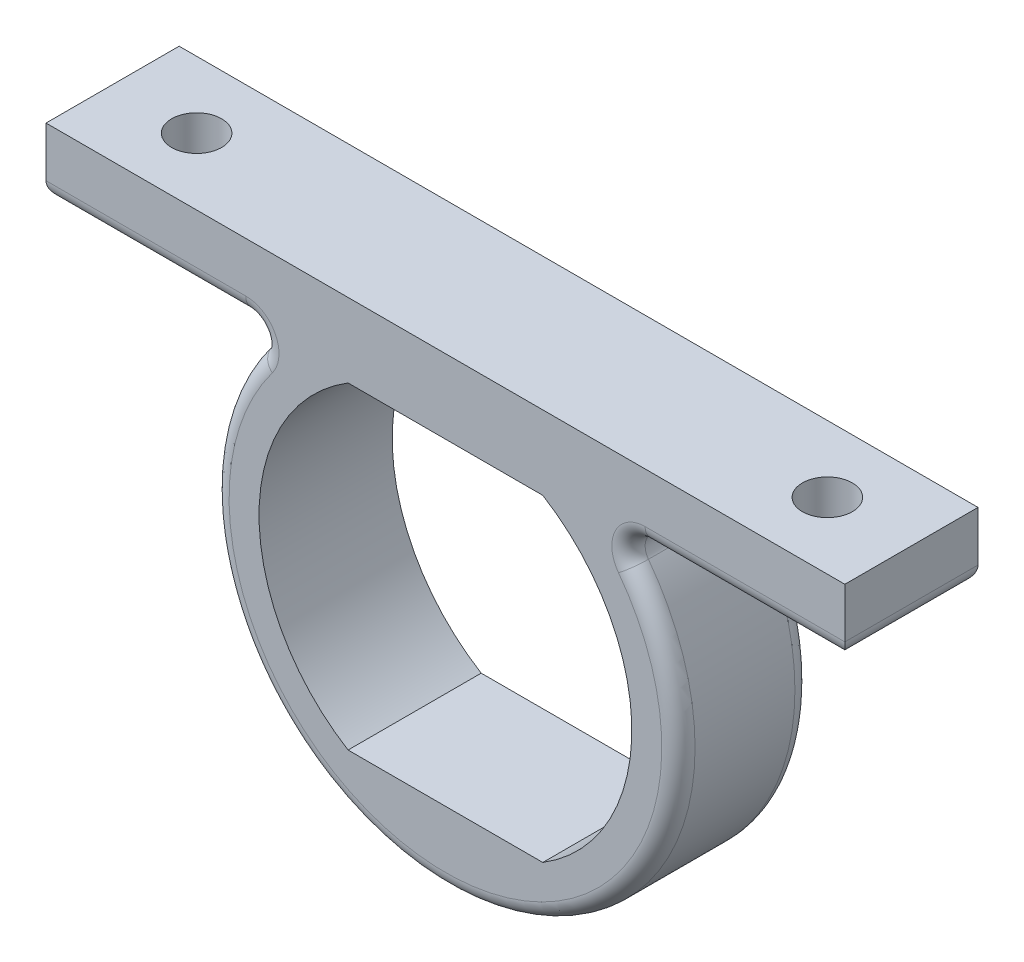
ISO-10303-21;
HEADER;
FILE_DESCRIPTION(('STEP AP214'),'2;1');
FILE_NAME('part.step','',(''),(''),'','','');
FILE_SCHEMA(('AUTOMOTIVE_DESIGN { 1 0 10303 214 1 1 1 1 }'));
ENDSEC;
DATA;
#1=APPLICATION_CONTEXT('core data for automotive mechanical design processes');
#2=APPLICATION_PROTOCOL_DEFINITION('international standard','automotive_design',2000,#1);
#3=PRODUCT_CONTEXT('',#1,'mechanical');
#4=PRODUCT('Part','Part','',(#3));
#5=PRODUCT_RELATED_PRODUCT_CATEGORY('part','',(#4));
#6=PRODUCT_DEFINITION_FORMATION('','',#4);
#7=PRODUCT_DEFINITION_CONTEXT('part definition',#1,'design');
#8=PRODUCT_DEFINITION('design','',#6,#7);
#9=PRODUCT_DEFINITION_SHAPE('','',#8);
#10=(LENGTH_UNIT() NAMED_UNIT(*) SI_UNIT(.MILLI.,.METRE.));
#11=(NAMED_UNIT(*) PLANE_ANGLE_UNIT() SI_UNIT($,.RADIAN.));
#12=(NAMED_UNIT(*) SI_UNIT($,.STERADIAN.) SOLID_ANGLE_UNIT());
#13=UNCERTAINTY_MEASURE_WITH_UNIT(LENGTH_MEASURE(1.E-05),#10,'distance_accuracy_value','');
#14=(GEOMETRIC_REPRESENTATION_CONTEXT(3) GLOBAL_UNCERTAINTY_ASSIGNED_CONTEXT((#13)) GLOBAL_UNIT_ASSIGNED_CONTEXT((#10,
#11,#12)) REPRESENTATION_CONTEXT('',''));
#15=CARTESIAN_POINT('',(0.,0.,0.));
#16=DIRECTION('',(0.,0.,1.));
#17=DIRECTION('',(1.,0.,0.));
#18=AXIS2_PLACEMENT_3D('',#15,#16,#17);
#19=CARTESIAN_POINT('',(0.,14.,8.));
#20=DIRECTION('',(0.,-1.,0.));
#21=DIRECTION('',(1.,0.,0.));
#22=AXIS2_PLACEMENT_3D('',#19,#20,#21);
#23=PLANE('',#22);
#24=CARTESIAN_POINT('',(18.9494897427832,14.,4.));
#25=DIRECTION('',(0.,-1.,0.));
#26=DIRECTION('',(0.,0.,-1.));
#27=AXIS2_PLACEMENT_3D('',#24,#25,#26);
#28=CIRCLE('',#27,1.5);
#29=CARTESIAN_POINT('',(18.9494897427832,14.,2.5));
#30=VERTEX_POINT('',#29);
#31=EDGE_CURVE('E444',#30,#30,#28,.T.);
#32=ORIENTED_EDGE('',*,*,#31,.T.);
#33=EDGE_LOOP('',(#32));
#34=FACE_BOUND('',#33,.T.);
#35=CARTESIAN_POINT('',(-18.9494897427832,14.,4.));
#36=DIRECTION('',(0.,-1.,0.));
#37=DIRECTION('',(0.,0.,-1.));
#38=AXIS2_PLACEMENT_3D('',#35,#36,#37);
#39=CIRCLE('',#38,1.5);
#40=CARTESIAN_POINT('',(-18.9494897427832,14.,2.5));
#41=VERTEX_POINT('',#40);
#42=EDGE_CURVE('E278',#41,#41,#39,.T.);
#43=ORIENTED_EDGE('',*,*,#42,.T.);
#44=EDGE_LOOP('',(#43));
#45=FACE_BOUND('',#44,.T.);
#46=DIRECTION('',(-1.,0.,0.));
#47=VECTOR('',#46,1.);
#48=CARTESIAN_POINT('',(0.,14.,0.));
#49=LINE('',#48,#47);
#50=CARTESIAN_POINT('',(24.,14.,0.));
#51=VERTEX_POINT('',#50);
#52=CARTESIAN_POINT('',(-24.,14.,0.));
#53=VERTEX_POINT('',#52);
#54=EDGE_CURVE('E211',#51,#53,#49,.T.);
#55=ORIENTED_EDGE('',*,*,#54,.T.);
#56=DIRECTION('',(0.,0.,-1.));
#57=VECTOR('',#56,1.);
#58=CARTESIAN_POINT('',(-24.,14.,8.));
#59=LINE('',#58,#57);
#60=CARTESIAN_POINT('',(-24.,14.,8.));
#61=VERTEX_POINT('',#60);
#62=EDGE_CURVE('E224',#61,#53,#59,.T.);
#63=ORIENTED_EDGE('',*,*,#62,.F.);
#64=DIRECTION('',(1.,0.,0.));
#65=VECTOR('',#64,1.);
#66=CARTESIAN_POINT('',(0.,14.,8.));
#67=LINE('',#66,#65);
#68=CARTESIAN_POINT('',(24.,14.,8.));
#69=VERTEX_POINT('',#68);
#70=EDGE_CURVE('E207',#61,#69,#67,.T.);
#71=ORIENTED_EDGE('',*,*,#70,.T.);
#72=DIRECTION('',(0.,0.,-1.));
#73=VECTOR('',#72,1.);
#74=CARTESIAN_POINT('',(24.,14.,8.));
#75=LINE('',#74,#73);
#76=EDGE_CURVE('E217',#69,#51,#75,.T.);
#77=ORIENTED_EDGE('',*,*,#76,.T.);
#78=EDGE_LOOP('',(#55,#63,#71,#77));
#79=FACE_BOUND('',#78,.T.);
#80=ADVANCED_FACE('F34',(#34,#45,#79),#23,.F.);
#81=CARTESIAN_POINT('',(-24.,14.,8.));
#82=DIRECTION('',(1.,0.,0.));
#83=DIRECTION('',(0.,0.,-1.));
#84=AXIS2_PLACEMENT_3D('',#81,#82,#83);
#85=PLANE('',#84);
#86=DIRECTION('',(0.,-1.,0.));
#87=VECTOR('',#86,1.);
#88=CARTESIAN_POINT('',(-24.,14.,0.));
#89=LINE('',#88,#87);
#90=CARTESIAN_POINT('',(-24.,11.,0.));
#91=VERTEX_POINT('',#90);
#92=EDGE_CURVE('E220',#53,#91,#89,.T.);
#93=ORIENTED_EDGE('',*,*,#92,.T.);
#94=DIRECTION('',(0.,0.,-1.));
#95=VECTOR('',#94,1.);
#96=CARTESIAN_POINT('',(-24.,11.,8.));
#97=LINE('',#96,#95);
#98=CARTESIAN_POINT('',(-24.,11.,8.));
#99=VERTEX_POINT('',#98);
#100=EDGE_CURVE('E268',#91,#99,#97,.F.);
#101=ORIENTED_EDGE('',*,*,#100,.T.);
#102=DIRECTION('',(0.,-1.,0.));
#103=VECTOR('',#102,1.);
#104=CARTESIAN_POINT('',(-24.,14.,8.));
#105=LINE('',#104,#103);
#106=EDGE_CURVE('E214',#61,#99,#105,.T.);
#107=ORIENTED_EDGE('',*,*,#106,.F.);
#108=ORIENTED_EDGE('',*,*,#62,.T.);
#109=EDGE_LOOP('',(#93,#101,#107,#108));
#110=FACE_BOUND('',#109,.T.);
#111=ADVANCED_FACE('F342',(#110),#85,.F.);
#112=CARTESIAN_POINT('',(-24.,10.,8.));
#113=DIRECTION('',(0.,1.,0.));
#114=DIRECTION('',(0.,0.,1.));
#115=AXIS2_PLACEMENT_3D('',#112,#113,#114);
#116=PLANE('',#115);
#117=CARTESIAN_POINT('',(-18.9494897427832,10.,4.));
#118=DIRECTION('',(0.,-1.,0.));
#119=DIRECTION('',(0.,0.,-1.));
#120=AXIS2_PLACEMENT_3D('',#117,#118,#119);
#121=CIRCLE('',#120,1.5);
#122=CARTESIAN_POINT('',(-18.9494897427832,10.,2.5));
#123=VERTEX_POINT('',#122);
#124=EDGE_CURVE('E191',#123,#123,#121,.T.);
#125=ORIENTED_EDGE('',*,*,#124,.F.);
#126=EDGE_LOOP('',(#125));
#127=FACE_BOUND('',#126,.T.);
#128=DIRECTION('',(1.,0.,0.));
#129=VECTOR('',#128,1.);
#130=CARTESIAN_POINT('',(-24.,10.,1.));
#131=LINE('',#130,#129);
#132=CARTESIAN_POINT('',(-23.,10.,1.));
#133=VERTEX_POINT('',#132);
#134=CARTESIAN_POINT('',(-12.,10.,1.));
#135=VERTEX_POINT('',#134);
#136=EDGE_CURVE('E238',#133,#135,#131,.T.);
#137=ORIENTED_EDGE('',*,*,#136,.T.);
#138=DIRECTION('',(0.,0.,1.));
#139=VECTOR('',#138,1.);
#140=CARTESIAN_POINT('',(-12.,10.,8.));
#141=LINE('',#140,#139);
#142=CARTESIAN_POINT('',(-12.,10.,7.));
#143=VERTEX_POINT('',#142);
#144=EDGE_CURVE('E243',#135,#143,#141,.T.);
#145=ORIENTED_EDGE('',*,*,#144,.T.);
#146=DIRECTION('',(1.,0.,0.));
#147=VECTOR('',#146,1.);
#148=CARTESIAN_POINT('',(-24.,10.,7.));
#149=LINE('',#148,#147);
#150=CARTESIAN_POINT('',(-23.,10.,7.));
#151=VERTEX_POINT('',#150);
#152=EDGE_CURVE('E240',#143,#151,#149,.F.);
#153=ORIENTED_EDGE('',*,*,#152,.T.);
#154=DIRECTION('',(0.,0.,-1.));
#155=VECTOR('',#154,1.);
#156=CARTESIAN_POINT('',(-23.,10.,8.));
#157=LINE('',#156,#155);
#158=EDGE_CURVE('E236',#151,#133,#157,.T.);
#159=ORIENTED_EDGE('',*,*,#158,.T.);
#160=EDGE_LOOP('',(#137,#145,#153,#159));
#161=FACE_BOUND('',#160,.T.);
#162=ADVANCED_FACE('F391',(#127,#161),#116,.F.);
#163=CARTESIAN_POINT('',(0.,0.,8.));
#164=DIRECTION('',(0.,0.,-1.));
#165=DIRECTION('',(-1.,0.,0.));
#166=AXIS2_PLACEMENT_3D('',#163,#164,#165);
#167=CYLINDRICAL_SURFACE('',#166,14.);
#168=CARTESIAN_POINT('',(0.,0.,7.));
#169=DIRECTION('',(0.,0.,1.));
#170=DIRECTION('',(1.,0.,0.));
#171=AXIS2_PLACEMENT_3D('',#168,#169,#170);
#172=CIRCLE('',#171,14.);
#173=CARTESIAN_POINT('',(11.2,8.4,7.));
#174=VERTEX_POINT('',#173);
#175=CARTESIAN_POINT('',(-11.2,8.4,7.));
#176=VERTEX_POINT('',#175);
#177=EDGE_CURVE('E51',#174,#176,#172,.F.);
#178=ORIENTED_EDGE('',*,*,#177,.T.);
#179=DIRECTION('',(0.,0.,-1.));
#180=VECTOR('',#179,1.);
#181=CARTESIAN_POINT('',(-11.2,8.4,8.));
#182=LINE('',#181,#180);
#183=CARTESIAN_POINT('',(-11.2,8.4,1.));
#184=VERTEX_POINT('',#183);
#185=EDGE_CURVE('E264',#176,#184,#182,.T.);
#186=ORIENTED_EDGE('',*,*,#185,.T.);
#187=CARTESIAN_POINT('',(0.,0.,1.));
#188=DIRECTION('',(0.,0.,1.));
#189=DIRECTION('',(1.,0.,0.));
#190=AXIS2_PLACEMENT_3D('',#187,#188,#189);
#191=CIRCLE('',#190,14.);
#192=CARTESIAN_POINT('',(11.2,8.4,1.));
#193=VERTEX_POINT('',#192);
#194=EDGE_CURVE('E260',#184,#193,#191,.T.);
#195=ORIENTED_EDGE('',*,*,#194,.T.);
#196=DIRECTION('',(0.,0.,-1.));
#197=VECTOR('',#196,1.);
#198=CARTESIAN_POINT('',(11.2,8.4,8.));
#199=LINE('',#198,#197);
#200=EDGE_CURVE('E56',#193,#174,#199,.F.);
#201=ORIENTED_EDGE('',*,*,#200,.T.);
#202=EDGE_LOOP('',(#178,#186,#195,#201));
#203=FACE_BOUND('',#202,.T.);
#204=ADVANCED_FACE('F395',(#203),#167,.T.);
#205=CARTESIAN_POINT('',(24.,10.,8.));
#206=DIRECTION('',(0.,-1.,0.));
#207=DIRECTION('',(0.,0.,-1.));
#208=AXIS2_PLACEMENT_3D('',#205,#206,#207);
#209=PLANE('',#208);
#210=CARTESIAN_POINT('',(18.9494897427832,10.,4.));
#211=DIRECTION('',(0.,-1.,0.));
#212=DIRECTION('',(0.,0.,-1.));
#213=AXIS2_PLACEMENT_3D('',#210,#211,#212);
#214=CIRCLE('',#213,1.5);
#215=CARTESIAN_POINT('',(18.9494897427832,10.,2.5));
#216=VERTEX_POINT('',#215);
#217=EDGE_CURVE('E447',#216,#216,#214,.T.);
#218=ORIENTED_EDGE('',*,*,#217,.F.);
#219=EDGE_LOOP('',(#218));
#220=FACE_BOUND('',#219,.T.);
#221=DIRECTION('',(-1.,0.,0.));
#222=VECTOR('',#221,1.);
#223=CARTESIAN_POINT('',(24.,10.,7.));
#224=LINE('',#223,#222);
#225=CARTESIAN_POINT('',(23.,10.,7.));
#226=VERTEX_POINT('',#225);
#227=CARTESIAN_POINT('',(12.,10.,7.));
#228=VERTEX_POINT('',#227);
#229=EDGE_CURVE('E255',#226,#228,#224,.T.);
#230=ORIENTED_EDGE('',*,*,#229,.T.);
#231=DIRECTION('',(0.,0.,-1.));
#232=VECTOR('',#231,1.);
#233=CARTESIAN_POINT('',(12.,10.,8.));
#234=LINE('',#233,#232);
#235=CARTESIAN_POINT('',(12.,10.,1.));
#236=VERTEX_POINT('',#235);
#237=EDGE_CURVE('E258',#228,#236,#234,.T.);
#238=ORIENTED_EDGE('',*,*,#237,.T.);
#239=DIRECTION('',(-1.,0.,0.));
#240=VECTOR('',#239,1.);
#241=CARTESIAN_POINT('',(24.,10.,1.));
#242=LINE('',#241,#240);
#243=CARTESIAN_POINT('',(23.,10.,1.));
#244=VERTEX_POINT('',#243);
#245=EDGE_CURVE('E253',#236,#244,#242,.F.);
#246=ORIENTED_EDGE('',*,*,#245,.T.);
#247=DIRECTION('',(0.,0.,-1.));
#248=VECTOR('',#247,1.);
#249=CARTESIAN_POINT('',(23.,10.,8.));
#250=LINE('',#249,#248);
#251=EDGE_CURVE('E251',#244,#226,#250,.F.);
#252=ORIENTED_EDGE('',*,*,#251,.T.);
#253=EDGE_LOOP('',(#230,#238,#246,#252));
#254=FACE_BOUND('',#253,.T.);
#255=ADVANCED_FACE('F370',(#220,#254),#209,.T.);
#256=CARTESIAN_POINT('',(24.,14.,8.));
#257=DIRECTION('',(1.,0.,0.));
#258=DIRECTION('',(0.,0.,-1.));
#259=AXIS2_PLACEMENT_3D('',#256,#257,#258);
#260=PLANE('',#259);
#261=DIRECTION('',(0.,-1.,0.));
#262=VECTOR('',#261,1.);
#263=CARTESIAN_POINT('',(24.,14.,8.));
#264=LINE('',#263,#262);
#265=CARTESIAN_POINT('',(24.,11.,8.));
#266=VERTEX_POINT('',#265);
#267=EDGE_CURVE('E210',#69,#266,#264,.T.);
#268=ORIENTED_EDGE('',*,*,#267,.T.);
#269=DIRECTION('',(0.,0.,-1.));
#270=VECTOR('',#269,1.);
#271=CARTESIAN_POINT('',(24.,11.,8.));
#272=LINE('',#271,#270);
#273=CARTESIAN_POINT('',(24.,11.,0.));
#274=VERTEX_POINT('',#273);
#275=EDGE_CURVE('E266',#266,#274,#272,.T.);
#276=ORIENTED_EDGE('',*,*,#275,.T.);
#277=DIRECTION('',(0.,-1.,0.));
#278=VECTOR('',#277,1.);
#279=CARTESIAN_POINT('',(24.,14.,0.));
#280=LINE('',#279,#278);
#281=EDGE_CURVE('E203',#51,#274,#280,.T.);
#282=ORIENTED_EDGE('',*,*,#281,.F.);
#283=ORIENTED_EDGE('',*,*,#76,.F.);
#284=EDGE_LOOP('',(#268,#276,#282,#283));
#285=FACE_BOUND('',#284,.T.);
#286=ADVANCED_FACE('F333',(#285),#260,.T.);
#287=CARTESIAN_POINT('',(0.,0.,8.));
#288=DIRECTION('',(0.,0.,1.));
#289=DIRECTION('',(1.,0.,0.));
#290=AXIS2_PLACEMENT_3D('',#287,#288,#289);
#291=PLANE('',#290);
#292=CARTESIAN_POINT('',(0.,0.,8.));
#293=DIRECTION('',(0.,0.,1.));
#294=DIRECTION('',(1.,0.,0.));
#295=AXIS2_PLACEMENT_3D('',#292,#293,#294);
#296=CIRCLE('',#295,11.2);
#297=CARTESIAN_POINT('',(-5.85,9.55078530802572,8.));
#298=VERTEX_POINT('',#297);
#299=CARTESIAN_POINT('',(-5.85,-9.55078530802572,8.));
#300=VERTEX_POINT('',#299);
#301=EDGE_CURVE('E167',#298,#300,#296,.T.);
#302=ORIENTED_EDGE('',*,*,#301,.F.);
#303=DIRECTION('',(-1.,0.,0.));
#304=VECTOR('',#303,1.);
#305=CARTESIAN_POINT('',(-5.85,9.55078530802572,8.));
#306=LINE('',#305,#304);
#307=CARTESIAN_POINT('',(5.85,9.55078530802573,8.));
#308=VERTEX_POINT('',#307);
#309=EDGE_CURVE('E185',#308,#298,#306,.T.);
#310=ORIENTED_EDGE('',*,*,#309,.F.);
#311=CARTESIAN_POINT('',(0.,0.,8.));
#312=DIRECTION('',(0.,0.,1.));
#313=DIRECTION('',(-1.,0.,0.));
#314=AXIS2_PLACEMENT_3D('',#311,#312,#313);
#315=CIRCLE('',#314,11.2);
#316=CARTESIAN_POINT('',(5.85,-9.55078530802572,8.));
#317=VERTEX_POINT('',#316);
#318=EDGE_CURVE('E188',#317,#308,#315,.T.);
#319=ORIENTED_EDGE('',*,*,#318,.F.);
#320=DIRECTION('',(1.,0.,0.));
#321=VECTOR('',#320,1.);
#322=CARTESIAN_POINT('',(-5.85,-9.55078530802572,8.));
#323=LINE('',#322,#321);
#324=EDGE_CURVE('E197',#300,#317,#323,.T.);
#325=ORIENTED_EDGE('',*,*,#324,.F.);
#326=EDGE_LOOP('',(#302,#310,#319,#325));
#327=FACE_BOUND('',#326,.T.);
#328=CARTESIAN_POINT('',(0.,0.,8.));
#329=DIRECTION('',(0.,0.,1.));
#330=DIRECTION('',(1.,0.,0.));
#331=AXIS2_PLACEMENT_3D('',#328,#329,#330);
#332=CIRCLE('',#331,13.);
#333=CARTESIAN_POINT('',(-10.4,7.8,8.));
#334=VERTEX_POINT('',#333);
#335=CARTESIAN_POINT('',(10.4,7.8,8.));
#336=VERTEX_POINT('',#335);
#337=EDGE_CURVE('E227',#334,#336,#332,.T.);
#338=ORIENTED_EDGE('',*,*,#337,.T.);
#339=CARTESIAN_POINT('',(12.,9.,8.));
#340=DIRECTION('',(0.,0.,1.));
#341=DIRECTION('',(1.,0.,0.));
#342=AXIS2_PLACEMENT_3D('',#339,#340,#341);
#343=CIRCLE('',#342,2.);
#344=CARTESIAN_POINT('',(12.,11.,8.));
#345=VERTEX_POINT('',#344);
#346=EDGE_CURVE('E43',#336,#345,#343,.F.);
#347=ORIENTED_EDGE('',*,*,#346,.T.);
#348=DIRECTION('',(-1.,0.,0.));
#349=VECTOR('',#348,1.);
#350=CARTESIAN_POINT('',(0.,11.,8.));
#351=LINE('',#350,#349);
#352=EDGE_CURVE('E231',#345,#266,#351,.F.);
#353=ORIENTED_EDGE('',*,*,#352,.T.);
#354=ORIENTED_EDGE('',*,*,#267,.F.);
#355=ORIENTED_EDGE('',*,*,#70,.F.);
#356=ORIENTED_EDGE('',*,*,#106,.T.);
#357=DIRECTION('',(1.,0.,0.));
#358=VECTOR('',#357,1.);
#359=CARTESIAN_POINT('',(-9.79795897113272,11.,8.));
#360=LINE('',#359,#358);
#361=CARTESIAN_POINT('',(-12.,11.,8.));
#362=VERTEX_POINT('',#361);
#363=EDGE_CURVE('E233',#99,#362,#360,.T.);
#364=ORIENTED_EDGE('',*,*,#363,.T.);
#365=CARTESIAN_POINT('',(-12.,9.,8.));
#366=DIRECTION('',(0.,0.,1.));
#367=DIRECTION('',(1.,0.,0.));
#368=AXIS2_PLACEMENT_3D('',#365,#366,#367);
#369=CIRCLE('',#368,2.);
#370=EDGE_CURVE('E270',#362,#334,#369,.F.);
#371=ORIENTED_EDGE('',*,*,#370,.T.);
#372=EDGE_LOOP('',(#338,#347,#353,#354,#355,#356,#364,#371));
#373=FACE_BOUND('',#372,.T.);
#374=ADVANCED_FACE('F336',(#327,#373),#291,.T.);
#375=CARTESIAN_POINT('',(0.,0.,0.));
#376=DIRECTION('',(0.,0.,1.));
#377=DIRECTION('',(1.,0.,0.));
#378=AXIS2_PLACEMENT_3D('',#375,#376,#377);
#379=PLANE('',#378);
#380=DIRECTION('',(-1.,0.,0.));
#381=VECTOR('',#380,1.);
#382=CARTESIAN_POINT('',(-5.85,9.55078530802572,0.));
#383=LINE('',#382,#381);
#384=CARTESIAN_POINT('',(5.85,9.55078530802573,0.));
#385=VERTEX_POINT('',#384);
#386=CARTESIAN_POINT('',(-5.85,9.55078530802572,0.));
#387=VERTEX_POINT('',#386);
#388=EDGE_CURVE('E172',#385,#387,#383,.T.);
#389=ORIENTED_EDGE('',*,*,#388,.T.);
#390=CARTESIAN_POINT('',(0.,0.,0.));
#391=DIRECTION('',(0.,0.,1.));
#392=DIRECTION('',(1.,0.,0.));
#393=AXIS2_PLACEMENT_3D('',#390,#391,#392);
#394=CIRCLE('',#393,11.2);
#395=CARTESIAN_POINT('',(-5.85,-9.55078530802572,0.));
#396=VERTEX_POINT('',#395);
#397=EDGE_CURVE('E164',#387,#396,#394,.T.);
#398=ORIENTED_EDGE('',*,*,#397,.T.);
#399=DIRECTION('',(1.,0.,0.));
#400=VECTOR('',#399,1.);
#401=CARTESIAN_POINT('',(-5.85,-9.55078530802572,0.));
#402=LINE('',#401,#400);
#403=CARTESIAN_POINT('',(5.85,-9.55078530802572,0.));
#404=VERTEX_POINT('',#403);
#405=EDGE_CURVE('E176',#396,#404,#402,.T.);
#406=ORIENTED_EDGE('',*,*,#405,.T.);
#407=CARTESIAN_POINT('',(0.,0.,0.));
#408=DIRECTION('',(0.,0.,1.));
#409=DIRECTION('',(-1.,0.,0.));
#410=AXIS2_PLACEMENT_3D('',#407,#408,#409);
#411=CIRCLE('',#410,11.2);
#412=EDGE_CURVE('E180',#404,#385,#411,.T.);
#413=ORIENTED_EDGE('',*,*,#412,.T.);
#414=EDGE_LOOP('',(#389,#398,#406,#413));
#415=FACE_BOUND('',#414,.T.);
#416=CARTESIAN_POINT('',(0.,0.,0.));
#417=DIRECTION('',(0.,0.,1.));
#418=DIRECTION('',(1.,0.,0.));
#419=AXIS2_PLACEMENT_3D('',#416,#417,#418);
#420=CIRCLE('',#419,13.);
#421=CARTESIAN_POINT('',(10.4,7.8,0.));
#422=VERTEX_POINT('',#421);
#423=CARTESIAN_POINT('',(-10.4,7.8,0.));
#424=VERTEX_POINT('',#423);
#425=EDGE_CURVE('E245',#422,#424,#420,.F.);
#426=ORIENTED_EDGE('',*,*,#425,.T.);
#427=CARTESIAN_POINT('',(-12.,9.,0.));
#428=DIRECTION('',(0.,0.,1.));
#429=DIRECTION('',(1.,0.,0.));
#430=AXIS2_PLACEMENT_3D('',#427,#428,#429);
#431=CIRCLE('',#430,2.);
#432=CARTESIAN_POINT('',(-12.,11.,0.));
#433=VERTEX_POINT('',#432);
#434=EDGE_CURVE('E11',#424,#433,#431,.T.);
#435=ORIENTED_EDGE('',*,*,#434,.T.);
#436=DIRECTION('',(1.,0.,0.));
#437=VECTOR('',#436,1.);
#438=CARTESIAN_POINT('',(0.,11.,0.));
#439=LINE('',#438,#437);
#440=EDGE_CURVE('E249',#433,#91,#439,.F.);
#441=ORIENTED_EDGE('',*,*,#440,.T.);
#442=ORIENTED_EDGE('',*,*,#92,.F.);
#443=ORIENTED_EDGE('',*,*,#54,.F.);
#444=ORIENTED_EDGE('',*,*,#281,.T.);
#445=DIRECTION('',(-1.,0.,0.));
#446=VECTOR('',#445,1.);
#447=CARTESIAN_POINT('',(9.79795897113271,11.,0.));
#448=LINE('',#447,#446);
#449=CARTESIAN_POINT('',(12.,11.,0.));
#450=VERTEX_POINT('',#449);
#451=EDGE_CURVE('E247',#274,#450,#448,.T.);
#452=ORIENTED_EDGE('',*,*,#451,.T.);
#453=CARTESIAN_POINT('',(12.,9.,0.));
#454=DIRECTION('',(0.,0.,1.));
#455=DIRECTION('',(1.,0.,0.));
#456=AXIS2_PLACEMENT_3D('',#453,#454,#455);
#457=CIRCLE('',#456,2.);
#458=EDGE_CURVE('E272',#450,#422,#457,.T.);
#459=ORIENTED_EDGE('',*,*,#458,.T.);
#460=EDGE_LOOP('',(#426,#435,#441,#442,#443,#444,#452,#459));
#461=FACE_BOUND('',#460,.T.);
#462=ADVANCED_FACE('F182',(#415,#461),#379,.F.);
#463=CARTESIAN_POINT('',(0.,0.,0.));
#464=DIRECTION('',(0.,0.,1.));
#465=DIRECTION('',(1.,0.,0.));
#466=AXIS2_PLACEMENT_3D('',#463,#464,#465);
#467=CYLINDRICAL_SURFACE('',#466,11.2);
#468=ORIENTED_EDGE('',*,*,#301,.T.);
#469=DIRECTION('',(0.,0.,1.));
#470=VECTOR('',#469,1.);
#471=CARTESIAN_POINT('',(-5.85,-9.55078530802572,0.));
#472=LINE('',#471,#470);
#473=EDGE_CURVE('E160',#396,#300,#472,.T.);
#474=ORIENTED_EDGE('',*,*,#473,.F.);
#475=ORIENTED_EDGE('',*,*,#397,.F.);
#476=DIRECTION('',(0.,0.,1.));
#477=VECTOR('',#476,1.);
#478=CARTESIAN_POINT('',(-5.85,9.55078530802572,0.));
#479=LINE('',#478,#477);
#480=EDGE_CURVE('E201',#387,#298,#479,.T.);
#481=ORIENTED_EDGE('',*,*,#480,.T.);
#482=EDGE_LOOP('',(#468,#474,#475,#481));
#483=FACE_BOUND('',#482,.T.);
#484=ADVANCED_FACE('F162',(#483),#467,.F.);
#485=CARTESIAN_POINT('',(-5.85,9.55078530802572,0.));
#486=DIRECTION('',(0.,1.,0.));
#487=DIRECTION('',(0.,0.,1.));
#488=AXIS2_PLACEMENT_3D('',#485,#486,#487);
#489=PLANE('',#488);
#490=ORIENTED_EDGE('',*,*,#309,.T.);
#491=ORIENTED_EDGE('',*,*,#480,.F.);
#492=ORIENTED_EDGE('',*,*,#388,.F.);
#493=DIRECTION('',(0.,0.,1.));
#494=VECTOR('',#493,1.);
#495=CARTESIAN_POINT('',(5.85,9.55078530802573,0.));
#496=LINE('',#495,#494);
#497=EDGE_CURVE('E204',#385,#308,#496,.T.);
#498=ORIENTED_EDGE('',*,*,#497,.T.);
#499=EDGE_LOOP('',(#490,#491,#492,#498));
#500=FACE_BOUND('',#499,.T.);
#501=ADVANCED_FACE('F423',(#500),#489,.F.);
#502=CARTESIAN_POINT('',(0.,0.,0.));
#503=DIRECTION('',(0.,0.,1.));
#504=DIRECTION('',(1.,0.,0.));
#505=AXIS2_PLACEMENT_3D('',#502,#503,#504);
#506=CYLINDRICAL_SURFACE('',#505,11.2);
#507=ORIENTED_EDGE('',*,*,#318,.T.);
#508=ORIENTED_EDGE('',*,*,#497,.F.);
#509=ORIENTED_EDGE('',*,*,#412,.F.);
#510=DIRECTION('',(0.,0.,1.));
#511=VECTOR('',#510,1.);
#512=CARTESIAN_POINT('',(5.85,-9.55078530802572,0.));
#513=LINE('',#512,#511);
#514=EDGE_CURVE('E171',#404,#317,#513,.T.);
#515=ORIENTED_EDGE('',*,*,#514,.T.);
#516=EDGE_LOOP('',(#507,#508,#509,#515));
#517=FACE_BOUND('',#516,.T.);
#518=ADVANCED_FACE('F426',(#517),#506,.F.);
#519=CARTESIAN_POINT('',(-5.85,-9.55078530802572,0.));
#520=DIRECTION('',(0.,-1.,0.));
#521=DIRECTION('',(0.,0.,-1.));
#522=AXIS2_PLACEMENT_3D('',#519,#520,#521);
#523=PLANE('',#522);
#524=ORIENTED_EDGE('',*,*,#324,.T.);
#525=ORIENTED_EDGE('',*,*,#514,.F.);
#526=ORIENTED_EDGE('',*,*,#405,.F.);
#527=ORIENTED_EDGE('',*,*,#473,.T.);
#528=EDGE_LOOP('',(#524,#525,#526,#527));
#529=FACE_BOUND('',#528,.T.);
#530=ADVANCED_FACE('F177',(#529),#523,.F.);
#531=CARTESIAN_POINT('',(0.,11.,1.));
#532=DIRECTION('',(1.,0.,0.));
#533=DIRECTION('',(0.,0.,-1.));
#534=AXIS2_PLACEMENT_3D('',#531,#532,#533);
#535=CYLINDRICAL_SURFACE('',#534,1.);
#536=CARTESIAN_POINT('',(12.,11.,1.));
#537=DIRECTION('',(-1.,0.,0.));
#538=DIRECTION('',(0.,0.,1.));
#539=AXIS2_PLACEMENT_3D('',#536,#537,#538);
#540=CIRCLE('',#539,1.);
#541=EDGE_CURVE('E313',#450,#236,#540,.T.);
#542=ORIENTED_EDGE('',*,*,#541,.F.);
#543=ORIENTED_EDGE('',*,*,#451,.F.);
#544=CARTESIAN_POINT('',(23.,11.,1.));
#545=DIRECTION('',(-0.707106781186547,0.,-0.707106781186547));
#546=DIRECTION('',(0.707106781186547,0.,-0.707106781186547));
#547=AXIS2_PLACEMENT_3D('',#544,#545,#546);
#548=ELLIPSE('',#547,1.41421356237309,1.);
#549=EDGE_CURVE('E38',#244,#274,#548,.F.);
#550=ORIENTED_EDGE('',*,*,#549,.F.);
#551=ORIENTED_EDGE('',*,*,#245,.F.);
#552=EDGE_LOOP('',(#542,#543,#550,#551));
#553=FACE_BOUND('',#552,.T.);
#554=ADVANCED_FACE('F36',(#553),#535,.T.);
#555=CARTESIAN_POINT('',(23.,11.,8.));
#556=DIRECTION('',(0.,0.,-1.));
#557=DIRECTION('',(-1.,0.,0.));
#558=AXIS2_PLACEMENT_3D('',#555,#556,#557);
#559=CYLINDRICAL_SURFACE('',#558,1.);
#560=ORIENTED_EDGE('',*,*,#549,.T.);
#561=ORIENTED_EDGE('',*,*,#275,.F.);
#562=CARTESIAN_POINT('',(23.,11.,7.));
#563=DIRECTION('',(0.707106781186547,0.,-0.707106781186547));
#564=DIRECTION('',(-0.707106781186547,0.,-0.707106781186547));
#565=AXIS2_PLACEMENT_3D('',#562,#563,#564);
#566=ELLIPSE('',#565,1.41421356237309,1.);
#567=EDGE_CURVE('E311',#226,#266,#566,.F.);
#568=ORIENTED_EDGE('',*,*,#567,.F.);
#569=ORIENTED_EDGE('',*,*,#251,.F.);
#570=EDGE_LOOP('',(#560,#561,#568,#569));
#571=FACE_BOUND('',#570,.T.);
#572=ADVANCED_FACE('F324',(#571),#559,.T.);
#573=CARTESIAN_POINT('',(12.,9.,1.));
#574=DIRECTION('',(0.,0.,1.));
#575=DIRECTION('',(1.,0.,0.));
#576=AXIS2_PLACEMENT_3D('',#573,#574,#575);
#577=TOROIDAL_SURFACE('',#576,2.,1.);
#578=ORIENTED_EDGE('',*,*,#458,.F.);
#579=ORIENTED_EDGE('',*,*,#541,.T.);
#580=CARTESIAN_POINT('',(12.,9.,1.));
#581=DIRECTION('',(0.,0.,1.));
#582=DIRECTION('',(1.,0.,0.));
#583=AXIS2_PLACEMENT_3D('',#580,#581,#582);
#584=CIRCLE('',#583,1.);
#585=EDGE_CURVE('E308',#193,#236,#584,.F.);
#586=ORIENTED_EDGE('',*,*,#585,.F.);
#587=CARTESIAN_POINT('',(10.4,7.8,1.));
#588=DIRECTION('',(-0.6,0.8,0.));
#589=DIRECTION('',(-0.8,-0.6,0.));
#590=AXIS2_PLACEMENT_3D('',#587,#588,#589);
#591=CIRCLE('',#590,1.);
#592=EDGE_CURVE('E305',#422,#193,#591,.F.);
#593=ORIENTED_EDGE('',*,*,#592,.F.);
#594=EDGE_LOOP('',(#578,#579,#586,#593));
#595=FACE_BOUND('',#594,.T.);
#596=ADVANCED_FACE('F373',(#595),#577,.T.);
#597=CARTESIAN_POINT('',(24.,11.,7.));
#598=DIRECTION('',(-1.,0.,0.));
#599=DIRECTION('',(0.,0.,1.));
#600=AXIS2_PLACEMENT_3D('',#597,#598,#599);
#601=CYLINDRICAL_SURFACE('',#600,1.);
#602=ORIENTED_EDGE('',*,*,#567,.T.);
#603=ORIENTED_EDGE('',*,*,#352,.F.);
#604=CARTESIAN_POINT('',(12.,11.,7.));
#605=DIRECTION('',(-1.,0.,0.));
#606=DIRECTION('',(0.,0.,1.));
#607=AXIS2_PLACEMENT_3D('',#604,#605,#606);
#608=CIRCLE('',#607,1.);
#609=EDGE_CURVE('E302',#228,#345,#608,.T.);
#610=ORIENTED_EDGE('',*,*,#609,.F.);
#611=ORIENTED_EDGE('',*,*,#229,.F.);
#612=EDGE_LOOP('',(#602,#603,#610,#611));
#613=FACE_BOUND('',#612,.T.);
#614=ADVANCED_FACE('F366',(#613),#601,.T.);
#615=CARTESIAN_POINT('',(12.,9.,8.));
#616=DIRECTION('',(0.,0.,-1.));
#617=DIRECTION('',(-1.,0.,0.));
#618=AXIS2_PLACEMENT_3D('',#615,#616,#617);
#619=CYLINDRICAL_SURFACE('',#618,1.);
#620=ORIENTED_EDGE('',*,*,#585,.T.);
#621=ORIENTED_EDGE('',*,*,#237,.F.);
#622=CARTESIAN_POINT('',(12.,9.,7.));
#623=DIRECTION('',(0.,0.,1.));
#624=DIRECTION('',(1.,0.,0.));
#625=AXIS2_PLACEMENT_3D('',#622,#623,#624);
#626=CIRCLE('',#625,1.);
#627=EDGE_CURVE('E300',#174,#228,#626,.F.);
#628=ORIENTED_EDGE('',*,*,#627,.F.);
#629=ORIENTED_EDGE('',*,*,#200,.F.);
#630=EDGE_LOOP('',(#620,#621,#628,#629));
#631=FACE_BOUND('',#630,.T.);
#632=ADVANCED_FACE('F372',(#631),#619,.F.);
#633=CARTESIAN_POINT('',(0.,0.,1.));
#634=DIRECTION('',(0.,0.,1.));
#635=DIRECTION('',(1.,0.,0.));
#636=AXIS2_PLACEMENT_3D('',#633,#634,#635);
#637=TOROIDAL_SURFACE('',#636,13.,1.);
#638=ORIENTED_EDGE('',*,*,#592,.T.);
#639=ORIENTED_EDGE('',*,*,#194,.F.);
#640=CARTESIAN_POINT('',(-10.4,7.8,1.));
#641=DIRECTION('',(0.6,0.8,0.));
#642=DIRECTION('',(-0.8,0.6,0.));
#643=AXIS2_PLACEMENT_3D('',#640,#641,#642);
#644=CIRCLE('',#643,1.);
#645=EDGE_CURVE('E297',#424,#184,#644,.T.);
#646=ORIENTED_EDGE('',*,*,#645,.F.);
#647=ORIENTED_EDGE('',*,*,#425,.F.);
#648=EDGE_LOOP('',(#638,#639,#646,#647));
#649=FACE_BOUND('',#648,.T.);
#650=ADVANCED_FACE('F378',(#649),#637,.T.);
#651=CARTESIAN_POINT('',(12.,9.,7.));
#652=DIRECTION('',(0.,0.,1.));
#653=DIRECTION('',(1.,0.,0.));
#654=AXIS2_PLACEMENT_3D('',#651,#652,#653);
#655=TOROIDAL_SURFACE('',#654,2.,1.);
#656=ORIENTED_EDGE('',*,*,#609,.T.);
#657=ORIENTED_EDGE('',*,*,#346,.F.);
#658=CARTESIAN_POINT('',(10.4,7.8,7.));
#659=DIRECTION('',(-0.6,0.8,0.));
#660=DIRECTION('',(-0.8,-0.6,0.));
#661=AXIS2_PLACEMENT_3D('',#658,#659,#660);
#662=CIRCLE('',#661,1.);
#663=EDGE_CURVE('E291',#174,#336,#662,.F.);
#664=ORIENTED_EDGE('',*,*,#663,.F.);
#665=ORIENTED_EDGE('',*,*,#627,.T.);
#666=EDGE_LOOP('',(#656,#657,#664,#665));
#667=FACE_BOUND('',#666,.T.);
#668=ADVANCED_FACE('F363',(#667),#655,.T.);
#669=CARTESIAN_POINT('',(-12.,9.,1.));
#670=DIRECTION('',(0.,0.,1.));
#671=DIRECTION('',(1.,0.,0.));
#672=AXIS2_PLACEMENT_3D('',#669,#670,#671);
#673=TOROIDAL_SURFACE('',#672,2.,1.);
#674=CARTESIAN_POINT('',(-12.,9.,1.));
#675=DIRECTION('',(0.,0.,1.));
#676=DIRECTION('',(1.,0.,0.));
#677=AXIS2_PLACEMENT_3D('',#674,#675,#676);
#678=CIRCLE('',#677,1.);
#679=EDGE_CURVE('E289',#135,#184,#678,.F.);
#680=ORIENTED_EDGE('',*,*,#679,.F.);
#681=CARTESIAN_POINT('',(-12.,11.,1.));
#682=DIRECTION('',(1.,0.,0.));
#683=DIRECTION('',(0.,0.,-1.));
#684=AXIS2_PLACEMENT_3D('',#681,#682,#683);
#685=CIRCLE('',#684,1.);
#686=EDGE_CURVE('E294',#433,#135,#685,.F.);
#687=ORIENTED_EDGE('',*,*,#686,.F.);
#688=ORIENTED_EDGE('',*,*,#434,.F.);
#689=ORIENTED_EDGE('',*,*,#645,.T.);
#690=EDGE_LOOP('',(#680,#687,#688,#689));
#691=FACE_BOUND('',#690,.T.);
#692=ADVANCED_FACE('F384',(#691),#673,.T.);
#693=CARTESIAN_POINT('',(-24.,11.,1.));
#694=DIRECTION('',(1.,0.,0.));
#695=DIRECTION('',(0.,0.,-1.));
#696=AXIS2_PLACEMENT_3D('',#693,#694,#695);
#697=CYLINDRICAL_SURFACE('',#696,1.);
#698=ORIENTED_EDGE('',*,*,#686,.T.);
#699=ORIENTED_EDGE('',*,*,#136,.F.);
#700=CARTESIAN_POINT('',(-23.,11.,1.));
#701=DIRECTION('',(0.707106781186547,0.,-0.707106781186547));
#702=DIRECTION('',(-0.707106781186547,0.,-0.707106781186547));
#703=AXIS2_PLACEMENT_3D('',#700,#701,#702);
#704=ELLIPSE('',#703,1.41421356237309,1.);
#705=EDGE_CURVE('E286',#91,#133,#704,.F.);
#706=ORIENTED_EDGE('',*,*,#705,.F.);
#707=ORIENTED_EDGE('',*,*,#440,.F.);
#708=EDGE_LOOP('',(#698,#699,#706,#707));
#709=FACE_BOUND('',#708,.T.);
#710=ADVANCED_FACE('F389',(#709),#697,.T.);
#711=CARTESIAN_POINT('',(0.,0.,7.));
#712=DIRECTION('',(0.,0.,1.));
#713=DIRECTION('',(1.,0.,0.));
#714=AXIS2_PLACEMENT_3D('',#711,#712,#713);
#715=TOROIDAL_SURFACE('',#714,13.,1.);
#716=ORIENTED_EDGE('',*,*,#663,.T.);
#717=ORIENTED_EDGE('',*,*,#337,.F.);
#718=CARTESIAN_POINT('',(-10.4,7.8,7.));
#719=DIRECTION('',(0.6,0.8,0.));
#720=DIRECTION('',(-0.8,0.6,0.));
#721=AXIS2_PLACEMENT_3D('',#718,#719,#720);
#722=CIRCLE('',#721,1.);
#723=EDGE_CURVE('E283',#176,#334,#722,.T.);
#724=ORIENTED_EDGE('',*,*,#723,.F.);
#725=ORIENTED_EDGE('',*,*,#177,.F.);
#726=EDGE_LOOP('',(#716,#717,#724,#725));
#727=FACE_BOUND('',#726,.T.);
#728=ADVANCED_FACE('F360',(#727),#715,.T.);
#729=CARTESIAN_POINT('',(-12.,9.,8.));
#730=DIRECTION('',(0.,0.,-1.));
#731=DIRECTION('',(-1.,0.,0.));
#732=AXIS2_PLACEMENT_3D('',#729,#730,#731);
#733=CYLINDRICAL_SURFACE('',#732,1.);
#734=ORIENTED_EDGE('',*,*,#679,.T.);
#735=ORIENTED_EDGE('',*,*,#185,.F.);
#736=CARTESIAN_POINT('',(-12.,9.,7.));
#737=DIRECTION('',(0.,0.,1.));
#738=DIRECTION('',(1.,0.,0.));
#739=AXIS2_PLACEMENT_3D('',#736,#737,#738);
#740=CIRCLE('',#739,1.);
#741=EDGE_CURVE('E280',#143,#176,#740,.F.);
#742=ORIENTED_EDGE('',*,*,#741,.F.);
#743=ORIENTED_EDGE('',*,*,#144,.F.);
#744=EDGE_LOOP('',(#734,#735,#742,#743));
#745=FACE_BOUND('',#744,.T.);
#746=ADVANCED_FACE('F394',(#745),#733,.F.);
#747=CARTESIAN_POINT('',(-23.,11.,8.));
#748=DIRECTION('',(0.,0.,-1.));
#749=DIRECTION('',(-1.,0.,0.));
#750=AXIS2_PLACEMENT_3D('',#747,#748,#749);
#751=CYLINDRICAL_SURFACE('',#750,1.);
#752=ORIENTED_EDGE('',*,*,#705,.T.);
#753=ORIENTED_EDGE('',*,*,#158,.F.);
#754=CARTESIAN_POINT('',(-23.,11.,7.));
#755=DIRECTION('',(-0.707106781186547,0.,-0.707106781186547));
#756=DIRECTION('',(0.707106781186547,0.,-0.707106781186547));
#757=AXIS2_PLACEMENT_3D('',#754,#755,#756);
#758=ELLIPSE('',#757,1.41421356237309,1.);
#759=EDGE_CURVE('E277',#99,#151,#758,.F.);
#760=ORIENTED_EDGE('',*,*,#759,.F.);
#761=ORIENTED_EDGE('',*,*,#100,.F.);
#762=EDGE_LOOP('',(#752,#753,#760,#761));
#763=FACE_BOUND('',#762,.T.);
#764=ADVANCED_FACE('F348',(#763),#751,.T.);
#765=CARTESIAN_POINT('',(-12.,9.,7.));
#766=DIRECTION('',(0.,0.,1.));
#767=DIRECTION('',(1.,0.,0.));
#768=AXIS2_PLACEMENT_3D('',#765,#766,#767);
#769=TOROIDAL_SURFACE('',#768,2.,1.);
#770=ORIENTED_EDGE('',*,*,#723,.T.);
#771=ORIENTED_EDGE('',*,*,#370,.F.);
#772=CARTESIAN_POINT('',(-12.,11.,7.));
#773=DIRECTION('',(1.,0.,0.));
#774=DIRECTION('',(0.,0.,-1.));
#775=AXIS2_PLACEMENT_3D('',#772,#773,#774);
#776=CIRCLE('',#775,1.);
#777=EDGE_CURVE('E275',#143,#362,#776,.F.);
#778=ORIENTED_EDGE('',*,*,#777,.F.);
#779=ORIENTED_EDGE('',*,*,#741,.T.);
#780=EDGE_LOOP('',(#770,#771,#778,#779));
#781=FACE_BOUND('',#780,.T.);
#782=ADVANCED_FACE('F355',(#781),#769,.T.);
#783=CARTESIAN_POINT('',(0.,11.,7.));
#784=DIRECTION('',(-1.,0.,0.));
#785=DIRECTION('',(0.,0.,1.));
#786=AXIS2_PLACEMENT_3D('',#783,#784,#785);
#787=CYLINDRICAL_SURFACE('',#786,1.);
#788=ORIENTED_EDGE('',*,*,#759,.T.);
#789=ORIENTED_EDGE('',*,*,#152,.F.);
#790=ORIENTED_EDGE('',*,*,#777,.T.);
#791=ORIENTED_EDGE('',*,*,#363,.F.);
#792=EDGE_LOOP('',(#788,#789,#790,#791));
#793=FACE_BOUND('',#792,.T.);
#794=ADVANCED_FACE('F351',(#793),#787,.T.);
#795=CARTESIAN_POINT('',(-18.9494897427832,14.,4.));
#796=DIRECTION('',(0.,-1.,0.));
#797=DIRECTION('',(0.,0.,-1.));
#798=AXIS2_PLACEMENT_3D('',#795,#796,#797);
#799=CYLINDRICAL_SURFACE('',#798,1.5);
#800=ORIENTED_EDGE('',*,*,#42,.F.);
#801=EDGE_LOOP('',(#800));
#802=FACE_BOUND('',#801,.T.);
#803=ORIENTED_EDGE('',*,*,#124,.T.);
#804=EDGE_LOOP('',(#803));
#805=FACE_BOUND('',#804,.T.);
#806=ADVANCED_FACE('F433',(#802,#805),#799,.F.);
#807=CARTESIAN_POINT('',(18.9494897427832,14.,4.));
#808=DIRECTION('',(0.,-1.,0.));
#809=DIRECTION('',(0.,0.,-1.));
#810=AXIS2_PLACEMENT_3D('',#807,#808,#809);
#811=CYLINDRICAL_SURFACE('',#810,1.5);
#812=ORIENTED_EDGE('',*,*,#31,.F.);
#813=EDGE_LOOP('',(#812));
#814=FACE_BOUND('',#813,.T.);
#815=ORIENTED_EDGE('',*,*,#217,.T.);
#816=EDGE_LOOP('',(#815));
#817=FACE_BOUND('',#816,.T.);
#818=ADVANCED_FACE('F436',(#814,#817),#811,.F.);
#819=CLOSED_SHELL('',(#80,#111,#162,#204,#255,#286,#374,#462,#484,#501,#518,#530,#554,#572,#596,
#614,#632,#650,#668,#692,#710,#728,#746,#764,#782,#794,#806,#818));
#820=MANIFOLD_SOLID_BREP('B2',#819);
#821=ADVANCED_BREP_SHAPE_REPRESENTATION('',(#18,#820),#14);
#822=SHAPE_DEFINITION_REPRESENTATION(#9,#821);
ENDSEC;
END-ISO-10303-21;
